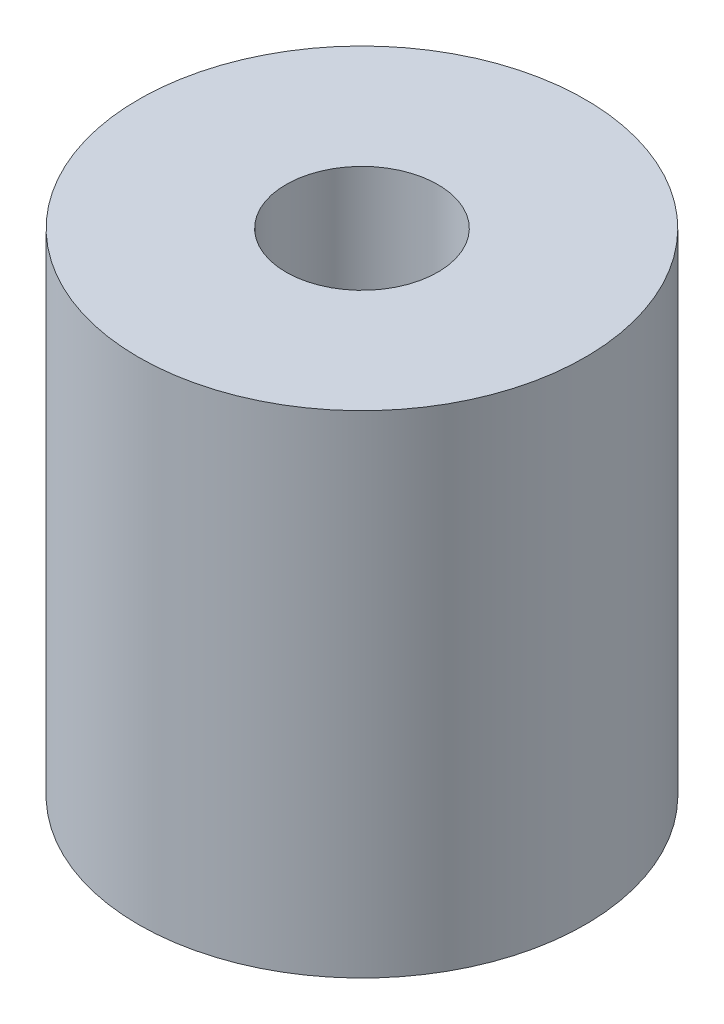
ISO-10303-21;
HEADER;
FILE_DESCRIPTION(('STEP AP214'),'2;1');
FILE_NAME('part.step','',(''),(''),'','','');
FILE_SCHEMA(('AUTOMOTIVE_DESIGN { 1 0 10303 214 1 1 1 1 }'));
ENDSEC;
DATA;
#1=APPLICATION_CONTEXT('core data for automotive mechanical design processes');
#2=APPLICATION_PROTOCOL_DEFINITION('international standard','automotive_design',2000,#1);
#3=PRODUCT_CONTEXT('',#1,'mechanical');
#4=PRODUCT('Part','Part','',(#3));
#5=PRODUCT_RELATED_PRODUCT_CATEGORY('part','',(#4));
#6=PRODUCT_DEFINITION_FORMATION('','',#4);
#7=PRODUCT_DEFINITION_CONTEXT('part definition',#1,'design');
#8=PRODUCT_DEFINITION('design','',#6,#7);
#9=PRODUCT_DEFINITION_SHAPE('','',#8);
#10=(LENGTH_UNIT() NAMED_UNIT(*) SI_UNIT(.MILLI.,.METRE.));
#11=(NAMED_UNIT(*) PLANE_ANGLE_UNIT() SI_UNIT($,.RADIAN.));
#12=(NAMED_UNIT(*) SI_UNIT($,.STERADIAN.) SOLID_ANGLE_UNIT());
#13=UNCERTAINTY_MEASURE_WITH_UNIT(LENGTH_MEASURE(1.E-05),#10,'distance_accuracy_value','');
#14=(GEOMETRIC_REPRESENTATION_CONTEXT(3) GLOBAL_UNCERTAINTY_ASSIGNED_CONTEXT((#13)) GLOBAL_UNIT_ASSIGNED_CONTEXT((#10,
#11,#12)) REPRESENTATION_CONTEXT('',''));
#15=CARTESIAN_POINT('',(0.,0.,0.));
#16=DIRECTION('',(0.,0.,1.));
#17=DIRECTION('',(1.,0.,0.));
#18=AXIS2_PLACEMENT_3D('',#15,#16,#17);
#19=CARTESIAN_POINT('',(0.,11.,0.));
#20=DIRECTION('',(0.,-1.,0.));
#21=DIRECTION('',(0.,0.,-1.));
#22=AXIS2_PLACEMENT_3D('',#19,#20,#21);
#23=CYLINDRICAL_SURFACE('',#22,5.);
#24=CARTESIAN_POINT('',(0.,11.,0.));
#25=DIRECTION('',(0.,1.,0.));
#26=DIRECTION('',(0.,0.,1.));
#27=AXIS2_PLACEMENT_3D('',#24,#25,#26);
#28=CIRCLE('',#27,5.);
#29=CARTESIAN_POINT('',(0.,11.,5.));
#30=VERTEX_POINT('',#29);
#31=EDGE_CURVE('E10',#30,#30,#28,.T.);
#32=ORIENTED_EDGE('',*,*,#31,.F.);
#33=EDGE_LOOP('',(#32));
#34=FACE_BOUND('',#33,.T.);
#35=CARTESIAN_POINT('',(0.,0.,0.));
#36=DIRECTION('',(0.,1.,0.));
#37=DIRECTION('',(0.,0.,1.));
#38=AXIS2_PLACEMENT_3D('',#35,#36,#37);
#39=CIRCLE('',#38,5.);
#40=CARTESIAN_POINT('',(0.,0.,5.));
#41=VERTEX_POINT('',#40);
#42=EDGE_CURVE('E37',#41,#41,#39,.T.);
#43=ORIENTED_EDGE('',*,*,#42,.T.);
#44=EDGE_LOOP('',(#43));
#45=FACE_BOUND('',#44,.T.);
#46=ADVANCED_FACE('F40',(#34,#45),#23,.T.);
#47=CARTESIAN_POINT('',(0.,11.,0.));
#48=DIRECTION('',(0.,1.,0.));
#49=DIRECTION('',(0.,0.,1.));
#50=AXIS2_PLACEMENT_3D('',#47,#48,#49);
#51=PLANE('',#50);
#52=CARTESIAN_POINT('',(0.,11.,0.));
#53=DIRECTION('',(0.,1.,0.));
#54=DIRECTION('',(0.,0.,1.));
#55=AXIS2_PLACEMENT_3D('',#52,#53,#54);
#56=CIRCLE('',#55,1.7);
#57=CARTESIAN_POINT('',(0.,11.,1.7));
#58=VERTEX_POINT('',#57);
#59=EDGE_CURVE('E51',#58,#58,#56,.T.);
#60=ORIENTED_EDGE('',*,*,#59,.F.);
#61=EDGE_LOOP('',(#60));
#62=FACE_BOUND('',#61,.T.);
#63=ORIENTED_EDGE('',*,*,#31,.T.);
#64=EDGE_LOOP('',(#63));
#65=FACE_BOUND('',#64,.T.);
#66=ADVANCED_FACE('F60',(#62,#65),#51,.T.);
#67=CARTESIAN_POINT('',(0.,0.,0.));
#68=DIRECTION('',(0.,1.,0.));
#69=DIRECTION('',(0.,0.,1.));
#70=AXIS2_PLACEMENT_3D('',#67,#68,#69);
#71=PLANE('',#70);
#72=CARTESIAN_POINT('',(0.,0.,0.));
#73=DIRECTION('',(0.,1.,0.));
#74=DIRECTION('',(0.,0.,1.));
#75=AXIS2_PLACEMENT_3D('',#72,#73,#74);
#76=CIRCLE('',#75,1.7);
#77=CARTESIAN_POINT('',(0.,0.,1.7));
#78=VERTEX_POINT('',#77);
#79=EDGE_CURVE('E50',#78,#78,#76,.T.);
#80=ORIENTED_EDGE('',*,*,#79,.T.);
#81=EDGE_LOOP('',(#80));
#82=FACE_BOUND('',#81,.T.);
#83=ORIENTED_EDGE('',*,*,#42,.F.);
#84=EDGE_LOOP('',(#83));
#85=FACE_BOUND('',#84,.T.);
#86=ADVANCED_FACE('F56',(#82,#85),#71,.F.);
#87=CARTESIAN_POINT('',(0.,11.,0.));
#88=DIRECTION('',(0.,1.,0.));
#89=DIRECTION('',(0.,0.,1.));
#90=AXIS2_PLACEMENT_3D('',#87,#88,#89);
#91=CYLINDRICAL_SURFACE('',#90,1.7);
#92=ORIENTED_EDGE('',*,*,#79,.F.);
#93=EDGE_LOOP('',(#92));
#94=FACE_BOUND('',#93,.T.);
#95=ORIENTED_EDGE('',*,*,#59,.T.);
#96=EDGE_LOOP('',(#95));
#97=FACE_BOUND('',#96,.T.);
#98=ADVANCED_FACE('F54',(#94,#97),#91,.F.);
#99=CLOSED_SHELL('',(#46,#66,#86,#98));
#100=MANIFOLD_SOLID_BREP('B2',#99);
#101=ADVANCED_BREP_SHAPE_REPRESENTATION('',(#18,#100),#14);
#102=SHAPE_DEFINITION_REPRESENTATION(#9,#101);
ENDSEC;
END-ISO-10303-21;
